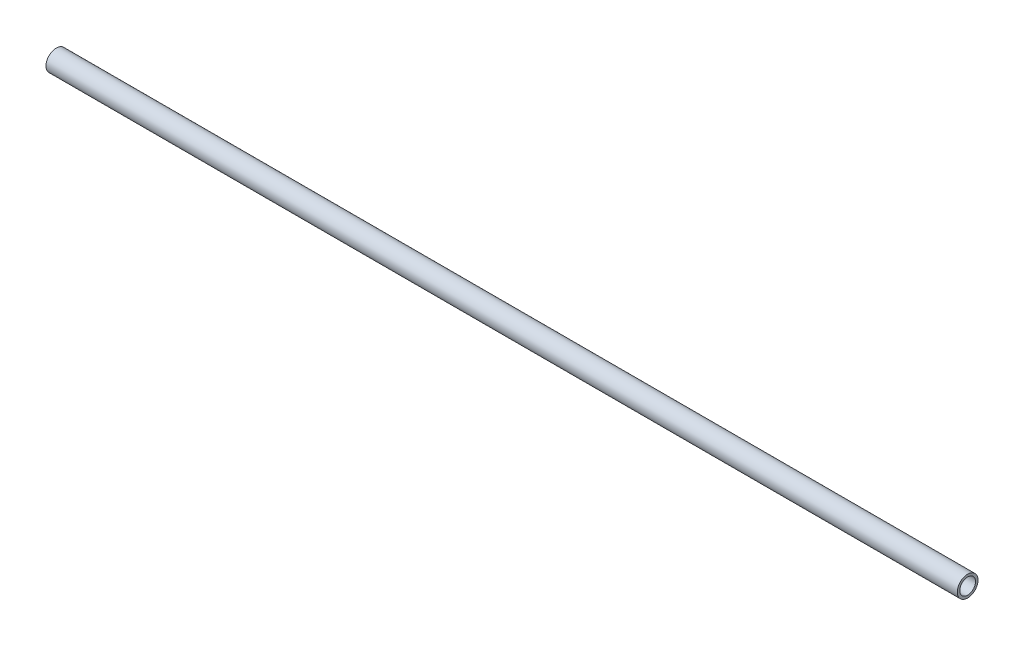
ISO-10303-21;
HEADER;
FILE_DESCRIPTION(('STEP AP214'),'2;1');
FILE_NAME('part.step','',(''),(''),'','','');
FILE_SCHEMA(('AUTOMOTIVE_DESIGN { 1 0 10303 214 1 1 1 1 }'));
ENDSEC;
DATA;
#1=APPLICATION_CONTEXT('core data for automotive mechanical design processes');
#2=APPLICATION_PROTOCOL_DEFINITION('international standard','automotive_design',2000,#1);
#3=PRODUCT_CONTEXT('',#1,'mechanical');
#4=PRODUCT('Part','Part','',(#3));
#5=PRODUCT_RELATED_PRODUCT_CATEGORY('part','',(#4));
#6=PRODUCT_DEFINITION_FORMATION('','',#4);
#7=PRODUCT_DEFINITION_CONTEXT('part definition',#1,'design');
#8=PRODUCT_DEFINITION('design','',#6,#7);
#9=PRODUCT_DEFINITION_SHAPE('','',#8);
#10=(LENGTH_UNIT() NAMED_UNIT(*) SI_UNIT(.MILLI.,.METRE.));
#11=(NAMED_UNIT(*) PLANE_ANGLE_UNIT() SI_UNIT($,.RADIAN.));
#12=(NAMED_UNIT(*) SI_UNIT($,.STERADIAN.) SOLID_ANGLE_UNIT());
#13=UNCERTAINTY_MEASURE_WITH_UNIT(LENGTH_MEASURE(1.E-05),#10,'distance_accuracy_value','');
#14=(GEOMETRIC_REPRESENTATION_CONTEXT(3) GLOBAL_UNCERTAINTY_ASSIGNED_CONTEXT((#13)) GLOBAL_UNIT_ASSIGNED_CONTEXT((#10,
#11,#12)) REPRESENTATION_CONTEXT('',''));
#15=CARTESIAN_POINT('',(0.,0.,0.));
#16=DIRECTION('',(0.,0.,1.));
#17=DIRECTION('',(1.,0.,0.));
#18=AXIS2_PLACEMENT_3D('',#15,#16,#17);
#19=CARTESIAN_POINT('',(1117.6,0.,0.));
#20=DIRECTION('',(1.,0.,0.));
#21=DIRECTION('',(0.,0.,-1.));
#22=AXIS2_PLACEMENT_3D('',#19,#20,#21);
#23=PLANE('',#22);
#24=CARTESIAN_POINT('',(1117.6,0.,0.));
#25=DIRECTION('',(1.,0.,0.));
#26=DIRECTION('',(0.,0.,-1.));
#27=AXIS2_PLACEMENT_3D('',#24,#25,#26);
#28=CIRCLE('',#27,12.7);
#29=CARTESIAN_POINT('',(1117.6,0.,-12.7));
#30=VERTEX_POINT('',#29);
#31=EDGE_CURVE('E10',#30,#30,#28,.T.);
#32=ORIENTED_EDGE('',*,*,#31,.T.);
#33=EDGE_LOOP('',(#32));
#34=FACE_BOUND('',#33,.T.);
#35=CARTESIAN_POINT('',(1117.6,0.,0.));
#36=DIRECTION('',(1.,0.,0.));
#37=DIRECTION('',(0.,0.,-1.));
#38=AXIS2_PLACEMENT_3D('',#35,#36,#37);
#39=CIRCLE('',#38,9.652);
#40=CARTESIAN_POINT('',(1117.6,0.,-9.652));
#41=VERTEX_POINT('',#40);
#42=EDGE_CURVE('E44',#41,#41,#39,.T.);
#43=ORIENTED_EDGE('',*,*,#42,.F.);
#44=EDGE_LOOP('',(#43));
#45=FACE_BOUND('',#44,.T.);
#46=ADVANCED_FACE('F33',(#34,#45),#23,.T.);
#47=CARTESIAN_POINT('',(0.,0.,0.));
#48=DIRECTION('',(1.,0.,0.));
#49=DIRECTION('',(0.,0.,-1.));
#50=AXIS2_PLACEMENT_3D('',#47,#48,#49);
#51=PLANE('',#50);
#52=CARTESIAN_POINT('',(0.,0.,0.));
#53=DIRECTION('',(1.,0.,0.));
#54=DIRECTION('',(0.,0.,-1.));
#55=AXIS2_PLACEMENT_3D('',#52,#53,#54);
#56=CIRCLE('',#55,12.7);
#57=CARTESIAN_POINT('',(0.,0.,-12.7));
#58=VERTEX_POINT('',#57);
#59=EDGE_CURVE('E37',#58,#58,#56,.T.);
#60=ORIENTED_EDGE('',*,*,#59,.F.);
#61=EDGE_LOOP('',(#60));
#62=FACE_BOUND('',#61,.T.);
#63=CARTESIAN_POINT('',(0.,0.,0.));
#64=DIRECTION('',(1.,0.,0.));
#65=DIRECTION('',(0.,0.,-1.));
#66=AXIS2_PLACEMENT_3D('',#63,#64,#65);
#67=CIRCLE('',#66,9.652);
#68=CARTESIAN_POINT('',(0.,0.,-9.652));
#69=VERTEX_POINT('',#68);
#70=EDGE_CURVE('E46',#69,#69,#67,.T.);
#71=ORIENTED_EDGE('',*,*,#70,.T.);
#72=EDGE_LOOP('',(#71));
#73=FACE_BOUND('',#72,.T.);
#74=ADVANCED_FACE('F56',(#62,#73),#51,.F.);
#75=CARTESIAN_POINT('',(1117.6,0.,0.));
#76=DIRECTION('',(-1.,0.,0.));
#77=DIRECTION('',(0.,0.,1.));
#78=AXIS2_PLACEMENT_3D('',#75,#76,#77);
#79=CYLINDRICAL_SURFACE('',#78,12.7);
#80=ORIENTED_EDGE('',*,*,#31,.F.);
#81=EDGE_LOOP('',(#80));
#82=FACE_BOUND('',#81,.T.);
#83=ORIENTED_EDGE('',*,*,#59,.T.);
#84=EDGE_LOOP('',(#83));
#85=FACE_BOUND('',#84,.T.);
#86=ADVANCED_FACE('F35',(#82,#85),#79,.T.);
#87=CARTESIAN_POINT('',(1117.6,0.,0.));
#88=DIRECTION('',(-1.,0.,0.));
#89=DIRECTION('',(0.,0.,1.));
#90=AXIS2_PLACEMENT_3D('',#87,#88,#89);
#91=CYLINDRICAL_SURFACE('',#90,9.652);
#92=ORIENTED_EDGE('',*,*,#42,.T.);
#93=EDGE_LOOP('',(#92));
#94=FACE_BOUND('',#93,.T.);
#95=ORIENTED_EDGE('',*,*,#70,.F.);
#96=EDGE_LOOP('',(#95));
#97=FACE_BOUND('',#96,.T.);
#98=ADVANCED_FACE('F52',(#94,#97),#91,.F.);
#99=CLOSED_SHELL('',(#46,#74,#86,#98));
#100=MANIFOLD_SOLID_BREP('B2',#99);
#101=ADVANCED_BREP_SHAPE_REPRESENTATION('',(#18,#100),#14);
#102=SHAPE_DEFINITION_REPRESENTATION(#9,#101);
ENDSEC;
END-ISO-10303-21;
